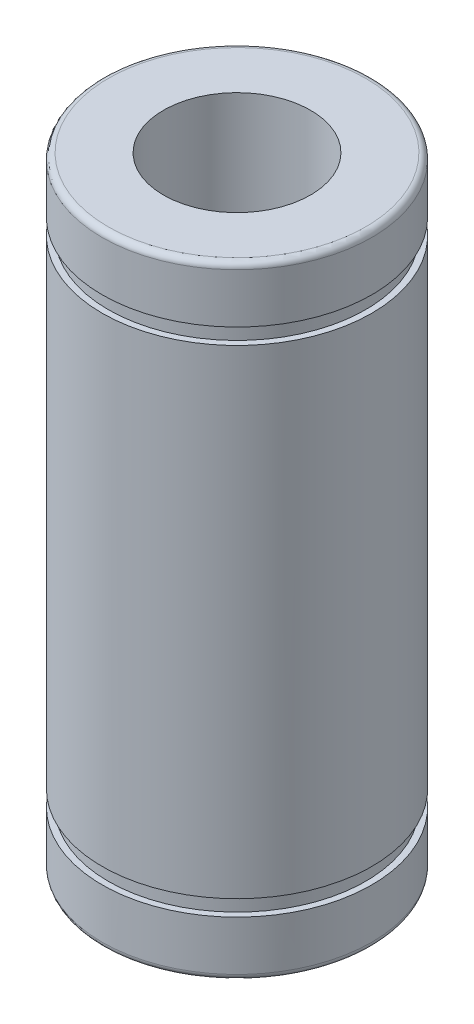
ISO-10303-21;
HEADER;
FILE_DESCRIPTION(('STEP AP214'),'2;1');
FILE_NAME('part.step','',(''),(''),'','','');
FILE_SCHEMA(('AUTOMOTIVE_DESIGN { 1 0 10303 214 1 1 1 1 }'));
ENDSEC;
DATA;
#1=APPLICATION_CONTEXT('core data for automotive mechanical design processes');
#2=APPLICATION_PROTOCOL_DEFINITION('international standard','automotive_design',2000,#1);
#3=PRODUCT_CONTEXT('',#1,'mechanical');
#4=PRODUCT('Part','Part','',(#3));
#5=PRODUCT_RELATED_PRODUCT_CATEGORY('part','',(#4));
#6=PRODUCT_DEFINITION_FORMATION('','',#4);
#7=PRODUCT_DEFINITION_CONTEXT('part definition',#1,'design');
#8=PRODUCT_DEFINITION('design','',#6,#7);
#9=PRODUCT_DEFINITION_SHAPE('','',#8);
#10=(LENGTH_UNIT() NAMED_UNIT(*) SI_UNIT(.MILLI.,.METRE.));
#11=(NAMED_UNIT(*) PLANE_ANGLE_UNIT() SI_UNIT($,.RADIAN.));
#12=(NAMED_UNIT(*) SI_UNIT($,.STERADIAN.) SOLID_ANGLE_UNIT());
#13=UNCERTAINTY_MEASURE_WITH_UNIT(LENGTH_MEASURE(1.E-05),#10,'distance_accuracy_value','');
#14=(GEOMETRIC_REPRESENTATION_CONTEXT(3) GLOBAL_UNCERTAINTY_ASSIGNED_CONTEXT((#13)) GLOBAL_UNIT_ASSIGNED_CONTEXT((#10,
#11,#12)) REPRESENTATION_CONTEXT('',''));
#15=CARTESIAN_POINT('',(0.,0.,0.));
#16=DIRECTION('',(0.,0.,1.));
#17=DIRECTION('',(1.,0.,0.));
#18=AXIS2_PLACEMENT_3D('',#15,#16,#17);
#19=CARTESIAN_POINT('',(0.,50.8,0.));
#20=DIRECTION('',(0.,-1.,0.));
#21=DIRECTION('',(0.,0.,-1.));
#22=AXIS2_PLACEMENT_3D('',#19,#20,#21);
#23=CYLINDRICAL_SURFACE('',#22,11.);
#24=CARTESIAN_POINT('',(0.,44.95,0.));
#25=DIRECTION('',(0.,1.,0.));
#26=DIRECTION('',(0.,0.,1.));
#27=AXIS2_PLACEMENT_3D('',#24,#25,#26);
#28=CIRCLE('',#27,11.);
#29=CARTESIAN_POINT('',(0.,44.95,11.));
#30=VERTEX_POINT('',#29);
#31=EDGE_CURVE('E66',#30,#30,#28,.T.);
#32=ORIENTED_EDGE('',*,*,#31,.F.);
#33=EDGE_LOOP('',(#32));
#34=FACE_BOUND('',#33,.T.);
#35=CARTESIAN_POINT('',(0.,5.85,0.));
#36=DIRECTION('',(0.,-1.,0.));
#37=DIRECTION('',(0.,0.,-1.));
#38=AXIS2_PLACEMENT_3D('',#35,#36,#37);
#39=CIRCLE('',#38,11.);
#40=CARTESIAN_POINT('',(0.,5.85,-11.));
#41=VERTEX_POINT('',#40);
#42=EDGE_CURVE('E82',#41,#41,#39,.T.);
#43=ORIENTED_EDGE('',*,*,#42,.F.);
#44=EDGE_LOOP('',(#43));
#45=FACE_BOUND('',#44,.T.);
#46=ADVANCED_FACE('F37',(#34,#45),#23,.T.);
#47=CARTESIAN_POINT('',(0.,0.5,0.));
#48=DIRECTION('',(0.,1.,0.));
#49=DIRECTION('',(0.,0.,1.));
#50=AXIS2_PLACEMENT_3D('',#47,#48,#49);
#51=CIRCLE('',#50,11.);
#52=CARTESIAN_POINT('',(0.,0.5,11.));
#53=VERTEX_POINT('',#52);
#54=EDGE_CURVE('E45',#53,#53,#51,.T.);
#55=ORIENTED_EDGE('',*,*,#54,.T.);
#56=EDGE_LOOP('',(#55));
#57=FACE_BOUND('',#56,.T.);
#58=CARTESIAN_POINT('',(0.,4.55,0.));
#59=DIRECTION('',(0.,-1.,0.));
#60=DIRECTION('',(0.,0.,-1.));
#61=AXIS2_PLACEMENT_3D('',#58,#59,#60);
#62=CIRCLE('',#61,11.);
#63=CARTESIAN_POINT('',(0.,4.55,-11.));
#64=VERTEX_POINT('',#63);
#65=EDGE_CURVE('E86',#64,#64,#62,.T.);
#66=ORIENTED_EDGE('',*,*,#65,.T.);
#67=EDGE_LOOP('',(#66));
#68=FACE_BOUND('',#67,.T.);
#69=ADVANCED_FACE('F114',(#57,#68),#23,.T.);
#70=CARTESIAN_POINT('',(0.,50.8,0.));
#71=DIRECTION('',(0.,1.,0.));
#72=DIRECTION('',(0.,0.,1.));
#73=AXIS2_PLACEMENT_3D('',#70,#71,#72);
#74=PLANE('',#73);
#75=CARTESIAN_POINT('',(0.,50.8,0.));
#76=DIRECTION('',(0.,1.,0.));
#77=DIRECTION('',(0.,0.,1.));
#78=AXIS2_PLACEMENT_3D('',#75,#76,#77);
#79=CIRCLE('',#78,10.5);
#80=CARTESIAN_POINT('',(0.,50.8,10.5));
#81=VERTEX_POINT('',#80);
#82=EDGE_CURVE('E55',#81,#81,#79,.T.);
#83=ORIENTED_EDGE('',*,*,#82,.T.);
#84=EDGE_LOOP('',(#83));
#85=FACE_BOUND('',#84,.T.);
#86=CARTESIAN_POINT('',(0.,50.8,0.));
#87=DIRECTION('',(0.,1.,0.));
#88=DIRECTION('',(0.,0.,1.));
#89=AXIS2_PLACEMENT_3D('',#86,#87,#88);
#90=CIRCLE('',#89,6.);
#91=CARTESIAN_POINT('',(0.,50.8,6.));
#92=VERTEX_POINT('',#91);
#93=EDGE_CURVE('E61',#92,#92,#90,.T.);
#94=ORIENTED_EDGE('',*,*,#93,.F.);
#95=EDGE_LOOP('',(#94));
#96=FACE_BOUND('',#95,.T.);
#97=ADVANCED_FACE('F121',(#85,#96),#74,.T.);
#98=CARTESIAN_POINT('',(0.,0.,0.));
#99=DIRECTION('',(0.,1.,0.));
#100=DIRECTION('',(0.,0.,1.));
#101=AXIS2_PLACEMENT_3D('',#98,#99,#100);
#102=PLANE('',#101);
#103=CARTESIAN_POINT('',(0.,0.,0.));
#104=DIRECTION('',(0.,1.,0.));
#105=DIRECTION('',(0.,0.,1.));
#106=AXIS2_PLACEMENT_3D('',#103,#104,#105);
#107=CIRCLE('',#106,10.5);
#108=CARTESIAN_POINT('',(0.,0.,10.5));
#109=VERTEX_POINT('',#108);
#110=EDGE_CURVE('E10',#109,#109,#107,.F.);
#111=ORIENTED_EDGE('',*,*,#110,.T.);
#112=EDGE_LOOP('',(#111));
#113=FACE_BOUND('',#112,.T.);
#114=CARTESIAN_POINT('',(0.,0.,0.));
#115=DIRECTION('',(0.,1.,0.));
#116=DIRECTION('',(0.,0.,1.));
#117=AXIS2_PLACEMENT_3D('',#114,#115,#116);
#118=CIRCLE('',#117,6.);
#119=CARTESIAN_POINT('',(0.,0.,6.));
#120=VERTEX_POINT('',#119);
#121=EDGE_CURVE('E62',#120,#120,#118,.T.);
#122=ORIENTED_EDGE('',*,*,#121,.T.);
#123=EDGE_LOOP('',(#122));
#124=FACE_BOUND('',#123,.T.);
#125=ADVANCED_FACE('F126',(#113,#124),#102,.F.);
#126=CARTESIAN_POINT('',(0.,50.3,0.));
#127=DIRECTION('',(0.,1.,0.));
#128=DIRECTION('',(0.,0.,1.));
#129=AXIS2_PLACEMENT_3D('',#126,#127,#128);
#130=CIRCLE('',#129,11.);
#131=CARTESIAN_POINT('',(0.,50.3,11.));
#132=VERTEX_POINT('',#131);
#133=EDGE_CURVE('E50',#132,#132,#130,.F.);
#134=ORIENTED_EDGE('',*,*,#133,.T.);
#135=EDGE_LOOP('',(#134));
#136=FACE_BOUND('',#135,.T.);
#137=CARTESIAN_POINT('',(0.,46.25,0.));
#138=DIRECTION('',(0.,1.,0.));
#139=DIRECTION('',(0.,0.,1.));
#140=AXIS2_PLACEMENT_3D('',#137,#138,#139);
#141=CIRCLE('',#140,11.);
#142=CARTESIAN_POINT('',(0.,46.25,11.));
#143=VERTEX_POINT('',#142);
#144=EDGE_CURVE('E70',#143,#143,#141,.T.);
#145=ORIENTED_EDGE('',*,*,#144,.T.);
#146=EDGE_LOOP('',(#145));
#147=FACE_BOUND('',#146,.T.);
#148=ADVANCED_FACE('F117',(#136,#147),#23,.T.);
#149=CARTESIAN_POINT('',(0.,50.8,0.));
#150=DIRECTION('',(0.,-1.,0.));
#151=DIRECTION('',(0.,0.,-1.));
#152=AXIS2_PLACEMENT_3D('',#149,#150,#151);
#153=CYLINDRICAL_SURFACE('',#152,6.);
#154=ORIENTED_EDGE('',*,*,#93,.T.);
#155=EDGE_LOOP('',(#154));
#156=FACE_BOUND('',#155,.T.);
#157=ORIENTED_EDGE('',*,*,#121,.F.);
#158=EDGE_LOOP('',(#157));
#159=FACE_BOUND('',#158,.T.);
#160=ADVANCED_FACE('F125',(#156,#159),#153,.F.);
#161=CARTESIAN_POINT('',(0.,44.95,0.));
#162=DIRECTION('',(0.,1.,0.));
#163=DIRECTION('',(0.,0.,1.));
#164=AXIS2_PLACEMENT_3D('',#161,#162,#163);
#165=PLANE('',#164);
#166=CARTESIAN_POINT('',(0.,44.95,0.));
#167=DIRECTION('',(0.,1.,0.));
#168=DIRECTION('',(0.,0.,1.));
#169=AXIS2_PLACEMENT_3D('',#166,#167,#168);
#170=CIRCLE('',#169,10.5);
#171=CARTESIAN_POINT('',(0.,44.95,10.5));
#172=VERTEX_POINT('',#171);
#173=EDGE_CURVE('E74',#172,#172,#170,.T.);
#174=ORIENTED_EDGE('',*,*,#173,.F.);
#175=EDGE_LOOP('',(#174));
#176=FACE_BOUND('',#175,.T.);
#177=ORIENTED_EDGE('',*,*,#31,.T.);
#178=EDGE_LOOP('',(#177));
#179=FACE_BOUND('',#178,.T.);
#180=ADVANCED_FACE('F132',(#176,#179),#165,.T.);
#181=CARTESIAN_POINT('',(0.,46.25,0.));
#182=DIRECTION('',(0.,1.,0.));
#183=DIRECTION('',(0.,0.,1.));
#184=AXIS2_PLACEMENT_3D('',#181,#182,#183);
#185=PLANE('',#184);
#186=CARTESIAN_POINT('',(0.,46.25,0.));
#187=DIRECTION('',(0.,1.,0.));
#188=DIRECTION('',(0.,0.,1.));
#189=AXIS2_PLACEMENT_3D('',#186,#187,#188);
#190=CIRCLE('',#189,10.5);
#191=CARTESIAN_POINT('',(0.,46.25,10.5));
#192=VERTEX_POINT('',#191);
#193=EDGE_CURVE('E78',#192,#192,#190,.T.);
#194=ORIENTED_EDGE('',*,*,#193,.T.);
#195=EDGE_LOOP('',(#194));
#196=FACE_BOUND('',#195,.T.);
#197=ORIENTED_EDGE('',*,*,#144,.F.);
#198=EDGE_LOOP('',(#197));
#199=FACE_BOUND('',#198,.T.);
#200=ADVANCED_FACE('F139',(#196,#199),#185,.F.);
#201=CARTESIAN_POINT('',(0.,44.95,0.));
#202=DIRECTION('',(0.,1.,0.));
#203=DIRECTION('',(0.,0.,1.));
#204=AXIS2_PLACEMENT_3D('',#201,#202,#203);
#205=CYLINDRICAL_SURFACE('',#204,10.5);
#206=ORIENTED_EDGE('',*,*,#173,.T.);
#207=EDGE_LOOP('',(#206));
#208=FACE_BOUND('',#207,.T.);
#209=ORIENTED_EDGE('',*,*,#193,.F.);
#210=EDGE_LOOP('',(#209));
#211=FACE_BOUND('',#210,.T.);
#212=ADVANCED_FACE('F109',(#208,#211),#205,.T.);
#213=CARTESIAN_POINT('',(0.,5.85,0.));
#214=DIRECTION('',(0.,-1.,0.));
#215=DIRECTION('',(0.,0.,-1.));
#216=AXIS2_PLACEMENT_3D('',#213,#214,#215);
#217=PLANE('',#216);
#218=CARTESIAN_POINT('',(0.,5.85,0.));
#219=DIRECTION('',(0.,-1.,0.));
#220=DIRECTION('',(0.,0.,-1.));
#221=AXIS2_PLACEMENT_3D('',#218,#219,#220);
#222=CIRCLE('',#221,10.5);
#223=CARTESIAN_POINT('',(0.,5.85,-10.5));
#224=VERTEX_POINT('',#223);
#225=EDGE_CURVE('E90',#224,#224,#222,.T.);
#226=ORIENTED_EDGE('',*,*,#225,.F.);
#227=EDGE_LOOP('',(#226));
#228=FACE_BOUND('',#227,.T.);
#229=ORIENTED_EDGE('',*,*,#42,.T.);
#230=EDGE_LOOP('',(#229));
#231=FACE_BOUND('',#230,.T.);
#232=ADVANCED_FACE('F105',(#228,#231),#217,.T.);
#233=CARTESIAN_POINT('',(0.,4.55,0.));
#234=DIRECTION('',(0.,-1.,0.));
#235=DIRECTION('',(0.,0.,-1.));
#236=AXIS2_PLACEMENT_3D('',#233,#234,#235);
#237=PLANE('',#236);
#238=CARTESIAN_POINT('',(0.,4.55,0.));
#239=DIRECTION('',(0.,-1.,0.));
#240=DIRECTION('',(0.,0.,-1.));
#241=AXIS2_PLACEMENT_3D('',#238,#239,#240);
#242=CIRCLE('',#241,10.5);
#243=CARTESIAN_POINT('',(0.,4.55,-10.5));
#244=VERTEX_POINT('',#243);
#245=EDGE_CURVE('E94',#244,#244,#242,.T.);
#246=ORIENTED_EDGE('',*,*,#245,.T.);
#247=EDGE_LOOP('',(#246));
#248=FACE_BOUND('',#247,.T.);
#249=ORIENTED_EDGE('',*,*,#65,.F.);
#250=EDGE_LOOP('',(#249));
#251=FACE_BOUND('',#250,.T.);
#252=ADVANCED_FACE('F108',(#248,#251),#237,.F.);
#253=CARTESIAN_POINT('',(0.,5.85,0.));
#254=DIRECTION('',(0.,-1.,0.));
#255=DIRECTION('',(0.,0.,-1.));
#256=AXIS2_PLACEMENT_3D('',#253,#254,#255);
#257=CYLINDRICAL_SURFACE('',#256,10.5);
#258=ORIENTED_EDGE('',*,*,#225,.T.);
#259=EDGE_LOOP('',(#258));
#260=FACE_BOUND('',#259,.T.);
#261=ORIENTED_EDGE('',*,*,#245,.F.);
#262=EDGE_LOOP('',(#261));
#263=FACE_BOUND('',#262,.T.);
#264=ADVANCED_FACE('F102',(#260,#263),#257,.T.);
#265=CARTESIAN_POINT('',(0.,50.3,0.));
#266=DIRECTION('',(0.,1.,0.));
#267=DIRECTION('',(0.,0.,1.));
#268=AXIS2_PLACEMENT_3D('',#265,#266,#267);
#269=TOROIDAL_SURFACE('',#268,10.5,0.5);
#270=ORIENTED_EDGE('',*,*,#133,.F.);
#271=EDGE_LOOP('',(#270));
#272=FACE_BOUND('',#271,.T.);
#273=ORIENTED_EDGE('',*,*,#82,.F.);
#274=EDGE_LOOP('',(#273));
#275=FACE_BOUND('',#274,.T.);
#276=ADVANCED_FACE('F163',(#272,#275),#269,.T.);
#277=CARTESIAN_POINT('',(0.,0.5,0.));
#278=DIRECTION('',(0.,1.,0.));
#279=DIRECTION('',(0.,0.,1.));
#280=AXIS2_PLACEMENT_3D('',#277,#278,#279);
#281=TOROIDAL_SURFACE('',#280,10.5,0.5);
#282=ORIENTED_EDGE('',*,*,#110,.F.);
#283=EDGE_LOOP('',(#282));
#284=FACE_BOUND('',#283,.T.);
#285=ORIENTED_EDGE('',*,*,#54,.F.);
#286=EDGE_LOOP('',(#285));
#287=FACE_BOUND('',#286,.T.);
#288=ADVANCED_FACE('F39',(#284,#287),#281,.T.);
#289=CLOSED_SHELL('',(#46,#69,#97,#125,#148,#160,#180,#200,#212,#232,#252,#264,#276,#288));
#290=MANIFOLD_SOLID_BREP('B2',#289);
#291=ADVANCED_BREP_SHAPE_REPRESENTATION('',(#18,#290),#14);
#292=SHAPE_DEFINITION_REPRESENTATION(#9,#291);
ENDSEC;
END-ISO-10303-21;
